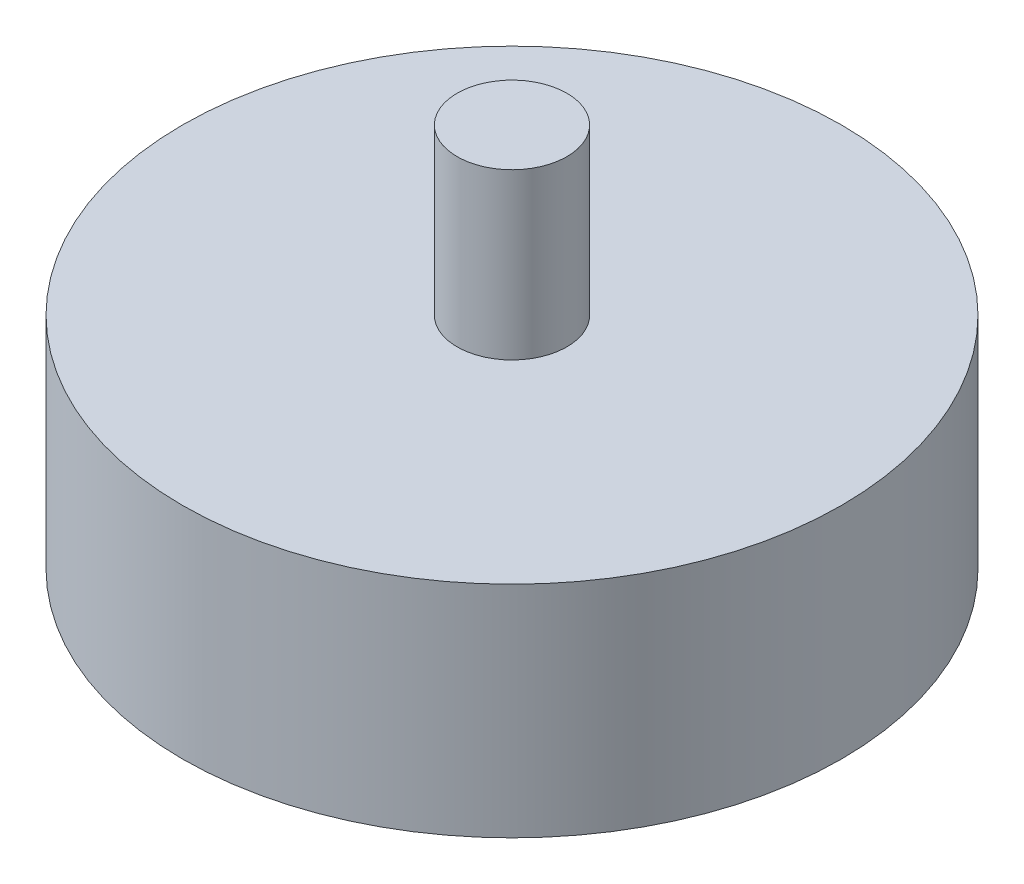
ISO-10303-21;
HEADER;
FILE_DESCRIPTION(('STEP AP214'),'2;1');
FILE_NAME('part.step','',(''),(''),'','','');
FILE_SCHEMA(('AUTOMOTIVE_DESIGN { 1 0 10303 214 1 1 1 1 }'));
ENDSEC;
DATA;
#1=APPLICATION_CONTEXT('core data for automotive mechanical design processes');
#2=APPLICATION_PROTOCOL_DEFINITION('international standard','automotive_design',2000,#1);
#3=PRODUCT_CONTEXT('',#1,'mechanical');
#4=PRODUCT('Part','Part','',(#3));
#5=PRODUCT_RELATED_PRODUCT_CATEGORY('part','',(#4));
#6=PRODUCT_DEFINITION_FORMATION('','',#4);
#7=PRODUCT_DEFINITION_CONTEXT('part definition',#1,'design');
#8=PRODUCT_DEFINITION('design','',#6,#7);
#9=PRODUCT_DEFINITION_SHAPE('','',#8);
#10=(LENGTH_UNIT() NAMED_UNIT(*) SI_UNIT(.MILLI.,.METRE.));
#11=(NAMED_UNIT(*) PLANE_ANGLE_UNIT() SI_UNIT($,.RADIAN.));
#12=(NAMED_UNIT(*) SI_UNIT($,.STERADIAN.) SOLID_ANGLE_UNIT());
#13=UNCERTAINTY_MEASURE_WITH_UNIT(LENGTH_MEASURE(1.E-05),#10,'distance_accuracy_value','');
#14=(GEOMETRIC_REPRESENTATION_CONTEXT(3) GLOBAL_UNCERTAINTY_ASSIGNED_CONTEXT((#13)) GLOBAL_UNIT_ASSIGNED_CONTEXT((#10,
#11,#12)) REPRESENTATION_CONTEXT('',''));
#15=CARTESIAN_POINT('',(0.,0.,0.));
#16=DIRECTION('',(0.,0.,1.));
#17=DIRECTION('',(1.,0.,0.));
#18=AXIS2_PLACEMENT_3D('',#15,#16,#17);
#19=CARTESIAN_POINT('',(0.,45.,0.));
#20=DIRECTION('',(0.,-1.,0.));
#21=DIRECTION('',(0.,0.,-1.));
#22=AXIS2_PLACEMENT_3D('',#19,#20,#21);
#23=CYLINDRICAL_SURFACE('',#22,5.);
#24=CARTESIAN_POINT('',(0.,30.,0.));
#25=DIRECTION('',(0.,1.,0.));
#26=DIRECTION('',(0.,0.,1.));
#27=AXIS2_PLACEMENT_3D('',#24,#25,#26);
#28=CIRCLE('',#27,5.);
#29=CARTESIAN_POINT('',(0.,30.,-5.));
#30=VERTEX_POINT('',#29);
#31=EDGE_CURVE('E46',#30,#30,#28,.T.);
#32=CARTESIAN_POINT('',(0.,45.,0.));
#33=DIRECTION('',(0.,1.,0.));
#34=DIRECTION('',(0.,0.,1.));
#35=AXIS2_PLACEMENT_3D('',#32,#33,#34);
#36=CIRCLE('',#35,5.);
#37=CARTESIAN_POINT('',(0.,45.,-5.));
#38=VERTEX_POINT('',#37);
#39=EDGE_CURVE('E51',#38,#38,#36,.T.);
#40=CARTESIAN_POINT('',(0.,30.,-5.));
#41=CARTESIAN_POINT('',(0.,30.15625,-5.));
#42=CARTESIAN_POINT('',(0.,30.3125,-5.));
#43=CARTESIAN_POINT('',(0.,30.625,-5.));
#44=CARTESIAN_POINT('',(0.,30.78125,-5.));
#45=CARTESIAN_POINT('',(0.,31.09375,-5.));
#46=CARTESIAN_POINT('',(0.,31.25,-5.));
#47=CARTESIAN_POINT('',(0.,31.5625,-5.));
#48=CARTESIAN_POINT('',(0.,31.71875,-5.));
#49=CARTESIAN_POINT('',(0.,32.03125,-5.));
#50=CARTESIAN_POINT('',(0.,32.1875,-5.));
#51=CARTESIAN_POINT('',(0.,32.5,-5.));
#52=CARTESIAN_POINT('',(0.,32.65625,-5.));
#53=CARTESIAN_POINT('',(0.,32.96875,-5.));
#54=CARTESIAN_POINT('',(0.,33.125,-5.));
#55=CARTESIAN_POINT('',(0.,33.4375,-5.));
#56=CARTESIAN_POINT('',(0.,33.59375,-5.));
#57=CARTESIAN_POINT('',(0.,33.90625,-5.));
#58=CARTESIAN_POINT('',(0.,34.0625,-5.));
#59=CARTESIAN_POINT('',(0.,34.375,-5.));
#60=CARTESIAN_POINT('',(0.,34.53125,-5.));
#61=CARTESIAN_POINT('',(0.,34.84375,-5.));
#62=CARTESIAN_POINT('',(0.,35.,-5.));
#63=CARTESIAN_POINT('',(0.,35.3125,-5.));
#64=CARTESIAN_POINT('',(0.,35.46875,-5.));
#65=CARTESIAN_POINT('',(0.,35.78125,-5.));
#66=CARTESIAN_POINT('',(0.,35.9375,-5.));
#67=CARTESIAN_POINT('',(0.,36.25,-5.));
#68=CARTESIAN_POINT('',(0.,36.40625,-5.));
#69=CARTESIAN_POINT('',(0.,36.71875,-5.));
#70=CARTESIAN_POINT('',(0.,36.875,-5.));
#71=CARTESIAN_POINT('',(0.,37.1875,-5.));
#72=CARTESIAN_POINT('',(0.,37.34375,-5.));
#73=CARTESIAN_POINT('',(0.,37.65625,-5.));
#74=CARTESIAN_POINT('',(0.,37.8125,-5.));
#75=CARTESIAN_POINT('',(0.,38.125,-5.));
#76=CARTESIAN_POINT('',(0.,38.28125,-5.));
#77=CARTESIAN_POINT('',(0.,38.59375,-5.));
#78=CARTESIAN_POINT('',(0.,38.75,-5.));
#79=CARTESIAN_POINT('',(0.,39.0625,-5.));
#80=CARTESIAN_POINT('',(0.,39.21875,-5.));
#81=CARTESIAN_POINT('',(0.,39.53125,-5.));
#82=CARTESIAN_POINT('',(0.,39.6875,-5.));
#83=CARTESIAN_POINT('',(0.,40.,-5.));
#84=CARTESIAN_POINT('',(0.,40.15625,-5.));
#85=CARTESIAN_POINT('',(0.,40.46875,-5.));
#86=CARTESIAN_POINT('',(0.,40.625,-5.));
#87=CARTESIAN_POINT('',(0.,40.9375,-5.));
#88=CARTESIAN_POINT('',(0.,41.09375,-5.));
#89=CARTESIAN_POINT('',(0.,41.40625,-5.));
#90=CARTESIAN_POINT('',(0.,41.5625,-5.));
#91=CARTESIAN_POINT('',(0.,41.875,-5.));
#92=CARTESIAN_POINT('',(0.,42.03125,-5.));
#93=CARTESIAN_POINT('',(0.,42.34375,-5.));
#94=CARTESIAN_POINT('',(0.,42.5,-5.));
#95=CARTESIAN_POINT('',(0.,42.8125,-5.));
#96=CARTESIAN_POINT('',(0.,42.96875,-5.));
#97=CARTESIAN_POINT('',(0.,43.28125,-5.));
#98=CARTESIAN_POINT('',(0.,43.4375,-5.));
#99=CARTESIAN_POINT('',(0.,43.75,-5.));
#100=CARTESIAN_POINT('',(0.,43.90625,-5.));
#101=CARTESIAN_POINT('',(0.,44.21875,-5.));
#102=CARTESIAN_POINT('',(0.,44.375,-5.));
#103=CARTESIAN_POINT('',(0.,44.6875,-5.));
#104=CARTESIAN_POINT('',(0.,44.84375,-5.));
#105=CARTESIAN_POINT('',(0.,45.,-5.));
#106=B_SPLINE_CURVE_WITH_KNOTS('',3,(#40,#41,#42,#43,#44,#45,#46,#47,#48,#49,#50,#51,#52,#53,
#54,#55,#56,#57,#58,#59,#60,#61,#62,#63,#64,#65,#66,#67,#68,#69,#70,#71,#72,#73,#74,#75,#76,#77,
#78,#79,#80,#81,#82,#83,#84,#85,#86,#87,#88,#89,#90,#91,#92,#93,#94,#95,#96,#97,#98,#99,#100,
#101,#102,#103,#104,#105),.UNSPECIFIED.,.F.,.F.,(4,2,2,2,2,2,2,2,2,2,2,2,2,2,2,2,2,2,2,2,2,2,2,
2,2,2,2,2,2,2,2,2,4),(0.,0.468749999999997,0.937500000000001,1.40625,1.875,2.34375,2.8125,
3.28125,3.75,4.21875,4.6875,5.15625,5.625,6.09374999999999,6.5625,7.03125,7.5,7.96875,8.4375,
8.90625,9.37499999999999,9.84375,10.3125,10.78125,11.25,11.71875,12.1875,12.65625,13.125,
13.59375,14.0625,14.53125,15.),.UNSPECIFIED.);
#107=EDGE_CURVE('BSEAM43',#30,#38,#106,.T.);
#108=ORIENTED_EDGE('',*,*,#31,.T.);
#109=ORIENTED_EDGE('',*,*,#39,.F.);
#110=ORIENTED_EDGE('',*,*,#107,.T.);
#111=ORIENTED_EDGE('',*,*,#107,.F.);
#112=EDGE_LOOP('',(#108,#110,#109,#111));
#113=FACE_BOUND('',#112,.T.);
#114=ADVANCED_FACE('F43',(#113),#23,.T.);
#115=CARTESIAN_POINT('',(0.,45.,0.));
#116=DIRECTION('',(0.,1.,0.));
#117=DIRECTION('',(0.,0.,1.));
#118=AXIS2_PLACEMENT_3D('',#115,#116,#117);
#119=PLANE('',#118);
#120=ORIENTED_EDGE('',*,*,#39,.T.);
#121=EDGE_LOOP('',(#120));
#122=FACE_BOUND('',#121,.T.);
#123=ADVANCED_FACE('F88',(#122),#119,.T.);
#124=CARTESIAN_POINT('',(0.,30.,0.));
#125=DIRECTION('',(0.,-1.,0.));
#126=DIRECTION('',(0.,0.,-1.));
#127=AXIS2_PLACEMENT_3D('',#124,#125,#126);
#128=CYLINDRICAL_SURFACE('',#127,30.);
#129=CARTESIAN_POINT('',(0.,30.,0.));
#130=DIRECTION('',(0.,1.,0.));
#131=DIRECTION('',(0.,0.,1.));
#132=AXIS2_PLACEMENT_3D('',#129,#130,#131);
#133=CIRCLE('',#132,30.);
#134=CARTESIAN_POINT('',(0.,30.,30.));
#135=VERTEX_POINT('',#134);
#136=EDGE_CURVE('E66',#135,#135,#133,.T.);
#137=ORIENTED_EDGE('',*,*,#136,.F.);
#138=EDGE_LOOP('',(#137));
#139=FACE_BOUND('',#138,.T.);
#140=CARTESIAN_POINT('',(0.,10.,0.));
#141=DIRECTION('',(0.,1.,0.));
#142=DIRECTION('',(0.,0.,1.));
#143=AXIS2_PLACEMENT_3D('',#140,#141,#142);
#144=CIRCLE('',#143,30.);
#145=CARTESIAN_POINT('',(0.,10.,30.));
#146=VERTEX_POINT('',#145);
#147=EDGE_CURVE('E62',#146,#146,#144,.T.);
#148=ORIENTED_EDGE('',*,*,#147,.T.);
#149=EDGE_LOOP('',(#148));
#150=FACE_BOUND('',#149,.T.);
#151=ADVANCED_FACE('F80',(#139,#150),#128,.T.);
#152=CARTESIAN_POINT('',(0.,30.,0.));
#153=DIRECTION('',(0.,1.,0.));
#154=DIRECTION('',(0.,0.,1.));
#155=AXIS2_PLACEMENT_3D('',#152,#153,#154);
#156=PLANE('',#155);
#157=ORIENTED_EDGE('',*,*,#31,.F.);
#158=EDGE_LOOP('',(#157));
#159=FACE_BOUND('',#158,.T.);
#160=ORIENTED_EDGE('',*,*,#136,.T.);
#161=EDGE_LOOP('',(#160));
#162=FACE_BOUND('',#161,.T.);
#163=ADVANCED_FACE('F77',(#159,#162),#156,.T.);
#164=CARTESIAN_POINT('',(0.,10.,0.));
#165=DIRECTION('',(0.,1.,0.));
#166=DIRECTION('',(0.,0.,1.));
#167=AXIS2_PLACEMENT_3D('',#164,#165,#166);
#168=PLANE('',#167);
#169=CARTESIAN_POINT('',(0.,10.,0.));
#170=DIRECTION('',(0.,1.,0.));
#171=DIRECTION('',(0.,0.,1.));
#172=AXIS2_PLACEMENT_3D('',#169,#170,#171);
#173=CIRCLE('',#172,5.);
#174=CARTESIAN_POINT('',(0.,10.,-5.));
#175=VERTEX_POINT('',#174);
#176=EDGE_CURVE('E10',#175,#175,#173,.T.);
#177=ORIENTED_EDGE('',*,*,#176,.T.);
#178=EDGE_LOOP('',(#177));
#179=FACE_BOUND('',#178,.T.);
#180=ORIENTED_EDGE('',*,*,#147,.F.);
#181=EDGE_LOOP('',(#180));
#182=FACE_BOUND('',#181,.T.);
#183=ADVANCED_FACE('F79',(#179,#182),#168,.F.);
#184=CARTESIAN_POINT('',(0.,0.,0.));
#185=DIRECTION('',(0.,1.,0.));
#186=DIRECTION('',(0.,0.,1.));
#187=AXIS2_PLACEMENT_3D('',#184,#185,#186);
#188=PLANE('',#187);
#189=CARTESIAN_POINT('',(0.,0.,0.));
#190=DIRECTION('',(0.,1.,0.));
#191=DIRECTION('',(0.,0.,1.));
#192=AXIS2_PLACEMENT_3D('',#189,#190,#191);
#193=CIRCLE('',#192,5.);
#194=CARTESIAN_POINT('',(0.,0.,-5.));
#195=VERTEX_POINT('',#194);
#196=EDGE_CURVE('E56',#195,#195,#193,.T.);
#197=ORIENTED_EDGE('',*,*,#196,.F.);
#198=EDGE_LOOP('',(#197));
#199=FACE_BOUND('',#198,.T.);
#200=ADVANCED_FACE('F86',(#199),#188,.F.);
#201=CARTESIAN_POINT('',(0.,0.,-5.));
#202=CARTESIAN_POINT('',(0.,0.10416666666666,-5.));
#203=CARTESIAN_POINT('',(0.,0.208333333333327,-5.));
#204=CARTESIAN_POINT('',(0.,0.41666666666666,-5.));
#205=CARTESIAN_POINT('',(0.,0.520833333333327,-5.));
#206=CARTESIAN_POINT('',(0.,0.72916666666666,-5.));
#207=CARTESIAN_POINT('',(0.,0.833333333333327,-5.));
#208=CARTESIAN_POINT('',(0.,1.04166666666666,-5.));
#209=CARTESIAN_POINT('',(0.,1.14583333333333,-5.));
#210=CARTESIAN_POINT('',(0.,1.35416666666666,-5.));
#211=CARTESIAN_POINT('',(0.,1.45833333333333,-5.));
#212=CARTESIAN_POINT('',(0.,1.66666666666666,-5.));
#213=CARTESIAN_POINT('',(0.,1.77083333333333,-5.));
#214=CARTESIAN_POINT('',(0.,1.97916666666666,-5.));
#215=CARTESIAN_POINT('',(0.,2.08333333333333,-5.));
#216=CARTESIAN_POINT('',(0.,2.29166666666666,-5.));
#217=CARTESIAN_POINT('',(0.,2.39583333333333,-5.));
#218=CARTESIAN_POINT('',(0.,2.60416666666666,-5.));
#219=CARTESIAN_POINT('',(0.,2.70833333333333,-5.));
#220=CARTESIAN_POINT('',(0.,2.91666666666666,-5.));
#221=CARTESIAN_POINT('',(0.,3.02083333333333,-5.));
#222=CARTESIAN_POINT('',(0.,3.22916666666666,-5.));
#223=CARTESIAN_POINT('',(0.,3.33333333333333,-5.));
#224=CARTESIAN_POINT('',(0.,3.54166666666666,-5.));
#225=CARTESIAN_POINT('',(0.,3.64583333333333,-5.));
#226=CARTESIAN_POINT('',(0.,3.85416666666666,-5.));
#227=CARTESIAN_POINT('',(0.,3.95833333333333,-5.));
#228=CARTESIAN_POINT('',(0.,4.16666666666666,-5.));
#229=CARTESIAN_POINT('',(0.,4.27083333333333,-5.));
#230=CARTESIAN_POINT('',(0.,4.47916666666666,-5.));
#231=CARTESIAN_POINT('',(0.,4.58333333333333,-5.));
#232=CARTESIAN_POINT('',(0.,4.79166666666666,-5.));
#233=CARTESIAN_POINT('',(0.,4.89583333333333,-5.));
#234=CARTESIAN_POINT('',(0.,5.10416666666666,-5.));
#235=CARTESIAN_POINT('',(0.,5.20833333333333,-5.));
#236=CARTESIAN_POINT('',(0.,5.41666666666666,-5.));
#237=CARTESIAN_POINT('',(0.,5.52083333333333,-5.));
#238=CARTESIAN_POINT('',(0.,5.72916666666666,-5.));
#239=CARTESIAN_POINT('',(0.,5.83333333333333,-5.));
#240=CARTESIAN_POINT('',(0.,6.04166666666667,-5.));
#241=CARTESIAN_POINT('',(0.,6.14583333333333,-5.));
#242=CARTESIAN_POINT('',(0.,6.35416666666667,-5.));
#243=CARTESIAN_POINT('',(0.,6.45833333333333,-5.));
#244=CARTESIAN_POINT('',(0.,6.66666666666667,-5.));
#245=CARTESIAN_POINT('',(0.,6.77083333333333,-5.));
#246=CARTESIAN_POINT('',(0.,6.97916666666667,-5.));
#247=CARTESIAN_POINT('',(0.,7.08333333333333,-5.));
#248=CARTESIAN_POINT('',(0.,7.29166666666667,-5.));
#249=CARTESIAN_POINT('',(0.,7.39583333333333,-5.));
#250=CARTESIAN_POINT('',(0.,7.60416666666667,-5.));
#251=CARTESIAN_POINT('',(0.,7.70833333333333,-5.));
#252=CARTESIAN_POINT('',(0.,7.91666666666667,-5.));
#253=CARTESIAN_POINT('',(0.,8.02083333333333,-5.));
#254=CARTESIAN_POINT('',(0.,8.22916666666667,-5.));
#255=CARTESIAN_POINT('',(0.,8.33333333333333,-5.));
#256=CARTESIAN_POINT('',(0.,8.54166666666667,-5.));
#257=CARTESIAN_POINT('',(0.,8.64583333333333,-5.));
#258=CARTESIAN_POINT('',(0.,8.85416666666667,-5.));
#259=CARTESIAN_POINT('',(0.,8.95833333333333,-5.));
#260=CARTESIAN_POINT('',(0.,9.16666666666667,-5.));
#261=CARTESIAN_POINT('',(0.,9.27083333333333,-5.));
#262=CARTESIAN_POINT('',(0.,9.47916666666667,-5.));
#263=CARTESIAN_POINT('',(0.,9.58333333333333,-5.));
#264=CARTESIAN_POINT('',(0.,9.79166666666667,-5.));
#265=CARTESIAN_POINT('',(0.,9.89583333333333,-5.));
#266=CARTESIAN_POINT('',(0.,10.,-5.));
#267=B_SPLINE_CURVE_WITH_KNOTS('',3,(#201,#202,#203,#204,#205,#206,#207,#208,#209,#210,#211,
#212,#213,#214,#215,#216,#217,#218,#219,#220,#221,#222,#223,#224,#225,#226,#227,#228,#229,#230,
#231,#232,#233,#234,#235,#236,#237,#238,#239,#240,#241,#242,#243,#244,#245,#246,#247,#248,#249,
#250,#251,#252,#253,#254,#255,#256,#257,#258,#259,#260,#261,#262,#263,#264,#265,#266),
.UNSPECIFIED.,.F.,.F.,(4,2,2,2,2,2,2,2,2,2,2,2,2,2,2,2,2,2,2,2,2,2,2,2,2,2,2,2,2,2,2,2,4),(0.,
0.3125,0.625000000000001,0.937500000000001,1.25,1.5625,1.875,2.1875,2.5,2.8125,3.125,3.4375,
3.75,4.0625,4.375,4.6875,5.,5.3125,5.62500000000001,5.93750000000001,6.25000000000001,
6.56250000000001,6.87500000000001,7.18750000000001,7.50000000000001,7.81250000000001,
8.12500000000001,8.43750000000001,8.75000000000001,9.06250000000001,9.37500000000001,
9.68750000000001,10.),.UNSPECIFIED.);
#268=EDGE_CURVE('BSEAM92',#195,#175,#267,.T.);
#269=ORIENTED_EDGE('',*,*,#196,.T.);
#270=ORIENTED_EDGE('',*,*,#176,.F.);
#271=ORIENTED_EDGE('',*,*,#268,.T.);
#272=ORIENTED_EDGE('',*,*,#268,.F.);
#273=EDGE_LOOP('',(#269,#271,#270,#272));
#274=FACE_BOUND('',#273,.T.);
#275=ADVANCED_FACE('F92',(#274),#23,.T.);
#276=CLOSED_SHELL('',(#114,#123,#151,#163,#183,#200,#275));
#277=MANIFOLD_SOLID_BREP('B2',#276);
#278=ADVANCED_BREP_SHAPE_REPRESENTATION('',(#18,#277),#14);
#279=SHAPE_DEFINITION_REPRESENTATION(#9,#278);
ENDSEC;
END-ISO-10303-21;
